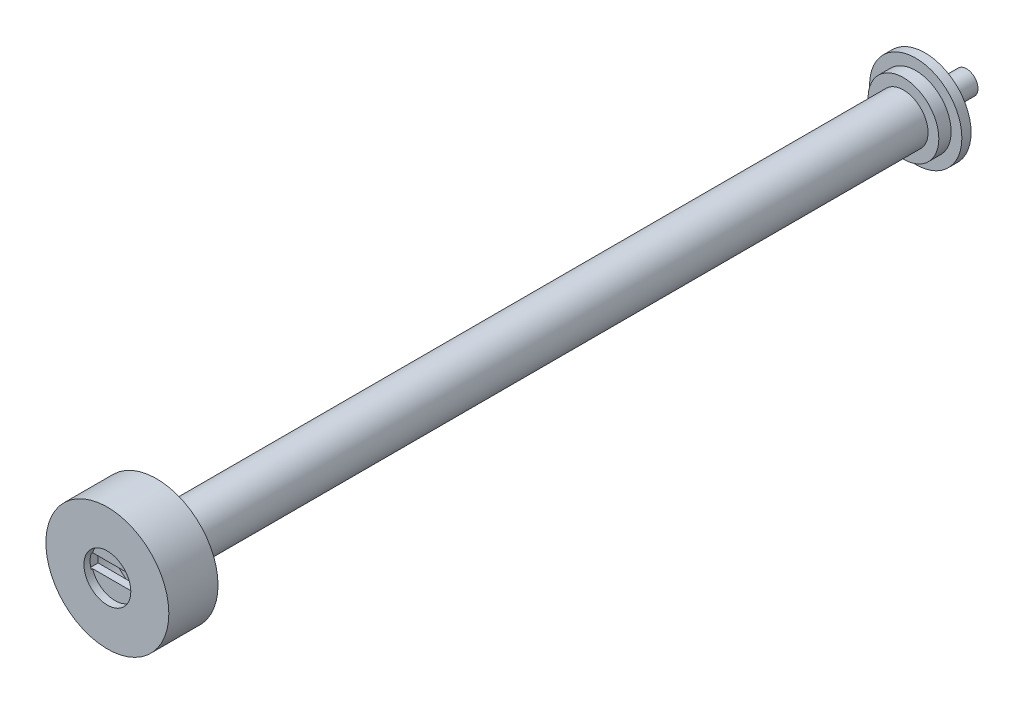
ISO-10303-21;
HEADER;
FILE_DESCRIPTION(('STEP AP214'),'2;1');
FILE_NAME('part.step','',(''),(''),'','','');
FILE_SCHEMA(('AUTOMOTIVE_DESIGN { 1 0 10303 214 1 1 1 1 }'));
ENDSEC;
DATA;
#1=APPLICATION_CONTEXT('core data for automotive mechanical design processes');
#2=APPLICATION_PROTOCOL_DEFINITION('international standard','automotive_design',2000,#1);
#3=PRODUCT_CONTEXT('',#1,'mechanical');
#4=PRODUCT('Part','Part','',(#3));
#5=PRODUCT_RELATED_PRODUCT_CATEGORY('part','',(#4));
#6=PRODUCT_DEFINITION_FORMATION('','',#4);
#7=PRODUCT_DEFINITION_CONTEXT('part definition',#1,'design');
#8=PRODUCT_DEFINITION('design','',#6,#7);
#9=PRODUCT_DEFINITION_SHAPE('','',#8);
#10=(LENGTH_UNIT() NAMED_UNIT(*) SI_UNIT(.MILLI.,.METRE.));
#11=(NAMED_UNIT(*) PLANE_ANGLE_UNIT() SI_UNIT($,.RADIAN.));
#12=(NAMED_UNIT(*) SI_UNIT($,.STERADIAN.) SOLID_ANGLE_UNIT());
#13=UNCERTAINTY_MEASURE_WITH_UNIT(LENGTH_MEASURE(1.E-05),#10,'distance_accuracy_value','');
#14=(GEOMETRIC_REPRESENTATION_CONTEXT(3) GLOBAL_UNCERTAINTY_ASSIGNED_CONTEXT((#13)) GLOBAL_UNIT_ASSIGNED_CONTEXT((#10,
#11,#12)) REPRESENTATION_CONTEXT('',''));
#15=CARTESIAN_POINT('',(0.,0.,0.));
#16=DIRECTION('',(0.,0.,1.));
#17=DIRECTION('',(1.,0.,0.));
#18=AXIS2_PLACEMENT_3D('',#15,#16,#17);
#19=CARTESIAN_POINT('',(0.,0.,165.6));
#20=DIRECTION('',(0.,0.,1.));
#21=DIRECTION('',(1.,0.,0.));
#22=AXIS2_PLACEMENT_3D('',#19,#20,#21);
#23=PLANE('',#22);
#24=DIRECTION('',(-1.,0.,0.));
#25=VECTOR('',#24,1.);
#26=CARTESIAN_POINT('',(175.2,45.9,165.6));
#27=LINE('',#26,#25);
#28=CARTESIAN_POINT('',(169.08581057582,45.9,165.6));
#29=VERTEX_POINT('',#28);
#30=CARTESIAN_POINT('',(168.8,45.9,165.6));
#31=VERTEX_POINT('',#30);
#32=EDGE_CURVE('E169',#29,#31,#27,.T.);
#33=ORIENTED_EDGE('',*,*,#32,.F.);
#34=CARTESIAN_POINT('',(172.,45.,165.6));
#35=DIRECTION('',(0.,0.,1.));
#36=DIRECTION('',(1.,0.,0.));
#37=AXIS2_PLACEMENT_3D('',#34,#35,#36);
#38=CIRCLE('',#37,3.05);
#39=CARTESIAN_POINT('',(169.08581057582,44.1,165.6));
#40=VERTEX_POINT('',#39);
#41=EDGE_CURVE('E231',#29,#40,#38,.T.);
#42=ORIENTED_EDGE('',*,*,#41,.T.);
#43=DIRECTION('',(1.,0.,0.));
#44=VECTOR('',#43,1.);
#45=CARTESIAN_POINT('',(168.8,44.1,165.6));
#46=LINE('',#45,#44);
#47=CARTESIAN_POINT('',(168.8,44.1,165.6));
#48=VERTEX_POINT('',#47);
#49=EDGE_CURVE('E165',#48,#40,#46,.T.);
#50=ORIENTED_EDGE('',*,*,#49,.F.);
#51=DIRECTION('',(0.,-1.,0.));
#52=VECTOR('',#51,1.);
#53=CARTESIAN_POINT('',(168.8,45.9,165.6));
#54=LINE('',#53,#52);
#55=EDGE_CURVE('E158',#31,#48,#54,.T.);
#56=ORIENTED_EDGE('',*,*,#55,.F.);
#57=EDGE_LOOP('',(#33,#42,#50,#56));
#58=FACE_BOUND('',#57,.T.);
#59=ADVANCED_FACE('F43',(#58),#23,.F.);
#60=CARTESIAN_POINT('',(172.,45.,160.8));
#61=DIRECTION('',(0.,0.,1.));
#62=DIRECTION('',(1.,0.,0.));
#63=AXIS2_PLACEMENT_3D('',#60,#61,#62);
#64=CYLINDRICAL_SURFACE('',#63,5.50000000000001);
#65=CARTESIAN_POINT('',(172.,45.,160.8));
#66=DIRECTION('',(0.,0.,1.));
#67=DIRECTION('',(1.,0.,0.));
#68=AXIS2_PLACEMENT_3D('',#65,#66,#67);
#69=CIRCLE('',#68,5.50000000000001);
#70=CARTESIAN_POINT('',(177.5,45.,160.8));
#71=VERTEX_POINT('',#70);
#72=EDGE_CURVE('E181',#71,#71,#69,.T.);
#73=ORIENTED_EDGE('',*,*,#72,.F.);
#74=EDGE_LOOP('',(#73));
#75=FACE_BOUND('',#74,.T.);
#76=CARTESIAN_POINT('',(172.,45.,164.4));
#77=DIRECTION('',(0.,0.,1.));
#78=DIRECTION('',(1.,0.,0.));
#79=AXIS2_PLACEMENT_3D('',#76,#77,#78);
#80=CIRCLE('',#79,5.50000000000001);
#81=CARTESIAN_POINT('',(177.5,45.,164.4));
#82=VERTEX_POINT('',#81);
#83=EDGE_CURVE('E179',#82,#82,#80,.T.);
#84=ORIENTED_EDGE('',*,*,#83,.T.);
#85=EDGE_LOOP('',(#84));
#86=FACE_BOUND('',#85,.T.);
#87=ADVANCED_FACE('F278',(#75,#86),#64,.F.);
#88=CARTESIAN_POINT('',(172.,45.,160.8));
#89=DIRECTION('',(0.,0.,1.));
#90=DIRECTION('',(1.,0.,0.));
#91=AXIS2_PLACEMENT_3D('',#88,#89,#90);
#92=PLANE('',#91);
#93=CARTESIAN_POINT('',(172.,45.,160.8));
#94=DIRECTION('',(0.,0.,1.));
#95=DIRECTION('',(1.,0.,0.));
#96=AXIS2_PLACEMENT_3D('',#93,#94,#95);
#97=CIRCLE('',#96,1.09999999999999);
#98=CARTESIAN_POINT('',(173.1,45.,160.8));
#99=VERTEX_POINT('',#98);
#100=EDGE_CURVE('E125',#99,#99,#97,.T.);
#101=ORIENTED_EDGE('',*,*,#100,.F.);
#102=EDGE_LOOP('',(#101));
#103=FACE_BOUND('',#102,.T.);
#104=ORIENTED_EDGE('',*,*,#72,.T.);
#105=EDGE_LOOP('',(#104));
#106=FACE_BOUND('',#105,.T.);
#107=ADVANCED_FACE('F289',(#103,#106),#92,.T.);
#108=CARTESIAN_POINT('',(172.,45.,164.4));
#109=DIRECTION('',(0.,0.,1.));
#110=DIRECTION('',(1.,0.,0.));
#111=AXIS2_PLACEMENT_3D('',#108,#109,#110);
#112=PLANE('',#111);
#113=DIRECTION('',(-1.,0.,0.));
#114=VECTOR('',#113,1.);
#115=CARTESIAN_POINT('',(172.,45.9,164.4));
#116=LINE('',#115,#114);
#117=CARTESIAN_POINT('',(175.2,45.9,164.4));
#118=VERTEX_POINT('',#117);
#119=CARTESIAN_POINT('',(168.8,45.9,164.4));
#120=VERTEX_POINT('',#119);
#121=EDGE_CURVE('E221',#118,#120,#116,.T.);
#122=ORIENTED_EDGE('',*,*,#121,.T.);
#123=DIRECTION('',(0.,-1.,0.));
#124=VECTOR('',#123,1.);
#125=CARTESIAN_POINT('',(168.8,45.,164.4));
#126=LINE('',#125,#124);
#127=CARTESIAN_POINT('',(168.8,44.1,164.4));
#128=VERTEX_POINT('',#127);
#129=EDGE_CURVE('E230',#120,#128,#126,.T.);
#130=ORIENTED_EDGE('',*,*,#129,.T.);
#131=DIRECTION('',(1.,0.,0.));
#132=VECTOR('',#131,1.);
#133=CARTESIAN_POINT('',(172.,44.1,164.4));
#134=LINE('',#133,#132);
#135=CARTESIAN_POINT('',(175.2,44.1,164.4));
#136=VERTEX_POINT('',#135);
#137=EDGE_CURVE('E217',#128,#136,#134,.T.);
#138=ORIENTED_EDGE('',*,*,#137,.T.);
#139=DIRECTION('',(0.,1.,0.));
#140=VECTOR('',#139,1.);
#141=CARTESIAN_POINT('',(175.2,45.,164.4));
#142=LINE('',#141,#140);
#143=EDGE_CURVE('E222',#136,#118,#142,.T.);
#144=ORIENTED_EDGE('',*,*,#143,.T.);
#145=EDGE_LOOP('',(#122,#130,#138,#144));
#146=FACE_BOUND('',#145,.T.);
#147=ORIENTED_EDGE('',*,*,#83,.F.);
#148=EDGE_LOOP('',(#147));
#149=FACE_BOUND('',#148,.T.);
#150=ADVANCED_FACE('F248',(#146,#149),#112,.F.);
#151=CARTESIAN_POINT('',(168.8,45.9,164.2));
#152=DIRECTION('',(-1.,0.,0.));
#153=DIRECTION('',(0.,0.,1.));
#154=AXIS2_PLACEMENT_3D('',#151,#152,#153);
#155=PLANE('',#154);
#156=DIRECTION('',(0.,0.,1.));
#157=VECTOR('',#156,1.);
#158=CARTESIAN_POINT('',(168.8,45.9,164.2));
#159=LINE('',#158,#157);
#160=EDGE_CURVE('E172',#120,#31,#159,.T.);
#161=ORIENTED_EDGE('',*,*,#160,.T.);
#162=ORIENTED_EDGE('',*,*,#55,.T.);
#163=DIRECTION('',(0.,0.,1.));
#164=VECTOR('',#163,1.);
#165=CARTESIAN_POINT('',(168.8,44.1,164.2));
#166=LINE('',#165,#164);
#167=EDGE_CURVE('E175',#128,#48,#166,.T.);
#168=ORIENTED_EDGE('',*,*,#167,.F.);
#169=ORIENTED_EDGE('',*,*,#129,.F.);
#170=EDGE_LOOP('',(#161,#162,#168,#169));
#171=FACE_BOUND('',#170,.T.);
#172=ADVANCED_FACE('F249',(#171),#155,.F.);
#173=CARTESIAN_POINT('',(175.2,45.9,164.2));
#174=DIRECTION('',(0.,1.,0.));
#175=DIRECTION('',(0.,0.,1.));
#176=AXIS2_PLACEMENT_3D('',#173,#174,#175);
#177=PLANE('',#176);
#178=DIRECTION('',(1.,0.,0.));
#179=VECTOR('',#178,1.);
#180=CARTESIAN_POINT('',(175.2,45.9,165.4));
#181=LINE('',#180,#179);
#182=CARTESIAN_POINT('',(169.08581057582,45.9,165.4));
#183=VERTEX_POINT('',#182);
#184=CARTESIAN_POINT('',(174.91418942418,45.9,165.4));
#185=VERTEX_POINT('',#184);
#186=EDGE_CURVE('E156',#183,#185,#181,.T.);
#187=ORIENTED_EDGE('',*,*,#186,.F.);
#188=DIRECTION('',(0.,0.,1.));
#189=VECTOR('',#188,1.);
#190=CARTESIAN_POINT('',(169.08581057582,45.9,165.4));
#191=LINE('',#190,#189);
#192=EDGE_CURVE('E147',#183,#29,#191,.T.);
#193=ORIENTED_EDGE('',*,*,#192,.T.);
#194=ORIENTED_EDGE('',*,*,#32,.T.);
#195=ORIENTED_EDGE('',*,*,#160,.F.);
#196=ORIENTED_EDGE('',*,*,#121,.F.);
#197=DIRECTION('',(0.,0.,1.));
#198=VECTOR('',#197,1.);
#199=CARTESIAN_POINT('',(175.2,45.9,164.2));
#200=LINE('',#199,#198);
#201=CARTESIAN_POINT('',(175.2,45.9,165.6));
#202=VERTEX_POINT('',#201);
#203=EDGE_CURVE('E176',#118,#202,#200,.T.);
#204=ORIENTED_EDGE('',*,*,#203,.T.);
#205=CARTESIAN_POINT('',(174.91418942418,45.9,165.6));
#206=VERTEX_POINT('',#205);
#207=EDGE_CURVE('E166',#202,#206,#27,.T.);
#208=ORIENTED_EDGE('',*,*,#207,.T.);
#209=DIRECTION('',(0.,0.,1.));
#210=VECTOR('',#209,1.);
#211=CARTESIAN_POINT('',(174.91418942418,45.9,165.4));
#212=LINE('',#211,#210);
#213=EDGE_CURVE('E62',#206,#185,#212,.F.);
#214=ORIENTED_EDGE('',*,*,#213,.T.);
#215=EDGE_LOOP('',(#187,#193,#194,#195,#196,#204,#208,#214));
#216=FACE_BOUND('',#215,.T.);
#217=ADVANCED_FACE('F254',(#216),#177,.F.);
#218=CARTESIAN_POINT('',(175.2,44.1,164.2));
#219=DIRECTION('',(1.,0.,0.));
#220=DIRECTION('',(0.,0.,-1.));
#221=AXIS2_PLACEMENT_3D('',#218,#219,#220);
#222=PLANE('',#221);
#223=DIRECTION('',(0.,0.,1.));
#224=VECTOR('',#223,1.);
#225=CARTESIAN_POINT('',(175.2,44.1,164.2));
#226=LINE('',#225,#224);
#227=CARTESIAN_POINT('',(175.2,44.1,165.6));
#228=VERTEX_POINT('',#227);
#229=EDGE_CURVE('E178',#136,#228,#226,.T.);
#230=ORIENTED_EDGE('',*,*,#229,.T.);
#231=DIRECTION('',(0.,1.,0.));
#232=VECTOR('',#231,1.);
#233=CARTESIAN_POINT('',(175.2,44.1,165.6));
#234=LINE('',#233,#232);
#235=EDGE_CURVE('E164',#228,#202,#234,.T.);
#236=ORIENTED_EDGE('',*,*,#235,.T.);
#237=ORIENTED_EDGE('',*,*,#203,.F.);
#238=ORIENTED_EDGE('',*,*,#143,.F.);
#239=EDGE_LOOP('',(#230,#236,#237,#238));
#240=FACE_BOUND('',#239,.T.);
#241=ADVANCED_FACE('F260',(#240),#222,.F.);
#242=CARTESIAN_POINT('',(168.8,44.1,164.2));
#243=DIRECTION('',(0.,-1.,0.));
#244=DIRECTION('',(0.,0.,-1.));
#245=AXIS2_PLACEMENT_3D('',#242,#243,#244);
#246=PLANE('',#245);
#247=DIRECTION('',(-1.,0.,0.));
#248=VECTOR('',#247,1.);
#249=CARTESIAN_POINT('',(168.8,44.1,165.4));
#250=LINE('',#249,#248);
#251=CARTESIAN_POINT('',(174.91418942418,44.1,165.4));
#252=VERTEX_POINT('',#251);
#253=CARTESIAN_POINT('',(169.08581057582,44.1,165.4));
#254=VERTEX_POINT('',#253);
#255=EDGE_CURVE('E114',#252,#254,#250,.T.);
#256=ORIENTED_EDGE('',*,*,#255,.F.);
#257=DIRECTION('',(0.,0.,1.));
#258=VECTOR('',#257,1.);
#259=CARTESIAN_POINT('',(174.91418942418,44.1,165.4));
#260=LINE('',#259,#258);
#261=CARTESIAN_POINT('',(174.91418942418,44.1,165.6));
#262=VERTEX_POINT('',#261);
#263=EDGE_CURVE('E141',#252,#262,#260,.T.);
#264=ORIENTED_EDGE('',*,*,#263,.T.);
#265=EDGE_CURVE('E161',#262,#228,#46,.T.);
#266=ORIENTED_EDGE('',*,*,#265,.T.);
#267=ORIENTED_EDGE('',*,*,#229,.F.);
#268=ORIENTED_EDGE('',*,*,#137,.F.);
#269=ORIENTED_EDGE('',*,*,#167,.T.);
#270=ORIENTED_EDGE('',*,*,#49,.T.);
#271=DIRECTION('',(0.,0.,1.));
#272=VECTOR('',#271,1.);
#273=CARTESIAN_POINT('',(169.08581057582,44.1,165.4));
#274=LINE('',#273,#272);
#275=EDGE_CURVE('E150',#40,#254,#274,.F.);
#276=ORIENTED_EDGE('',*,*,#275,.T.);
#277=EDGE_LOOP('',(#256,#264,#266,#267,#268,#269,#270,#276));
#278=FACE_BOUND('',#277,.T.);
#279=ADVANCED_FACE('F242',(#278),#246,.F.);
#280=ORIENTED_EDGE('',*,*,#265,.F.);
#281=EDGE_CURVE('E229',#262,#206,#38,.T.);
#282=ORIENTED_EDGE('',*,*,#281,.T.);
#283=ORIENTED_EDGE('',*,*,#207,.F.);
#284=ORIENTED_EDGE('',*,*,#235,.F.);
#285=EDGE_LOOP('',(#280,#282,#283,#284));
#286=FACE_BOUND('',#285,.T.);
#287=ADVANCED_FACE('F265',(#286),#23,.F.);
#288=CARTESIAN_POINT('',(172.,45.,165.4));
#289=DIRECTION('',(0.,0.,1.));
#290=DIRECTION('',(1.,0.,0.));
#291=AXIS2_PLACEMENT_3D('',#288,#289,#290);
#292=PLANE('',#291);
#293=ORIENTED_EDGE('',*,*,#186,.T.);
#294=CARTESIAN_POINT('',(172.,45.,165.4));
#295=DIRECTION('',(0.,0.,1.));
#296=DIRECTION('',(1.,0.,0.));
#297=AXIS2_PLACEMENT_3D('',#294,#295,#296);
#298=CIRCLE('',#297,3.05);
#299=EDGE_CURVE('E137',#185,#183,#298,.T.);
#300=ORIENTED_EDGE('',*,*,#299,.T.);
#301=EDGE_LOOP('',(#293,#300));
#302=FACE_BOUND('',#301,.T.);
#303=ADVANCED_FACE('F262',(#302),#292,.T.);
#304=ORIENTED_EDGE('',*,*,#255,.T.);
#305=EDGE_CURVE('E128',#254,#252,#298,.T.);
#306=ORIENTED_EDGE('',*,*,#305,.T.);
#307=EDGE_LOOP('',(#304,#306));
#308=FACE_BOUND('',#307,.T.);
#309=ADVANCED_FACE('F268',(#308),#292,.T.);
#310=CARTESIAN_POINT('',(172.,45.,165.4));
#311=DIRECTION('',(0.,0.,1.));
#312=DIRECTION('',(1.,0.,0.));
#313=AXIS2_PLACEMENT_3D('',#310,#311,#312);
#314=CYLINDRICAL_SURFACE('',#313,3.05);
#315=CARTESIAN_POINT('',(172.,45.,166.4));
#316=DIRECTION('',(0.,0.,1.));
#317=DIRECTION('',(1.,0.,0.));
#318=AXIS2_PLACEMENT_3D('',#315,#316,#317);
#319=CIRCLE('',#318,3.05);
#320=CARTESIAN_POINT('',(175.05,45.,166.4));
#321=VERTEX_POINT('',#320);
#322=EDGE_CURVE('E153',#321,#321,#319,.T.);
#323=ORIENTED_EDGE('',*,*,#322,.T.);
#324=EDGE_LOOP('',(#323));
#325=FACE_BOUND('',#324,.T.);
#326=ORIENTED_EDGE('',*,*,#299,.F.);
#327=ORIENTED_EDGE('',*,*,#213,.F.);
#328=ORIENTED_EDGE('',*,*,#281,.F.);
#329=ORIENTED_EDGE('',*,*,#263,.F.);
#330=ORIENTED_EDGE('',*,*,#305,.F.);
#331=ORIENTED_EDGE('',*,*,#275,.F.);
#332=ORIENTED_EDGE('',*,*,#41,.F.);
#333=ORIENTED_EDGE('',*,*,#192,.F.);
#334=EDGE_LOOP('',(#326,#327,#328,#329,#330,#331,#332,#333));
#335=FACE_BOUND('',#334,.T.);
#336=ADVANCED_FACE('F264',(#325,#335),#314,.F.);
#337=CARTESIAN_POINT('',(172.,45.,160.5));
#338=DIRECTION('',(0.,0.,-1.));
#339=DIRECTION('',(-1.,0.,0.));
#340=AXIS2_PLACEMENT_3D('',#337,#338,#339);
#341=CYLINDRICAL_SURFACE('',#340,3.20000000000001);
#342=CARTESIAN_POINT('',(172.,41.8,66.1));
#343=CARTESIAN_POINT('',(172.059912032794,41.7999995417529,66.1000006726438));
#344=CARTESIAN_POINT('',(172.119819319531,41.8016978680528,66.0950895000888));
#345=CARTESIAN_POINT('',(172.237862937075,41.8083049955069,66.0756392723217));
#346=CARTESIAN_POINT('',(172.295999193789,41.813213930789,66.0610998148735));
#347=CARTESIAN_POINT('',(172.408781951913,41.8257104106645,66.022954777006));
#348=CARTESIAN_POINT('',(172.463434316581,41.8332933065901,65.9993649244331));
#349=CARTESIAN_POINT('',(172.568006060973,41.8503682960829,65.9438619661876));
#350=CARTESIAN_POINT('',(172.617924413942,41.8598608024364,65.911947060507));
#351=CARTESIAN_POINT('',(172.713435821471,41.8801485772047,65.8394762756631));
#352=CARTESIAN_POINT('',(172.758832146365,41.8909764668898,65.7986703139808));
#353=CARTESIAN_POINT('',(172.842289495185,41.9125398939186,65.7101071678055));
#354=CARTESIAN_POINT('',(172.880348763375,41.9232754085714,65.6623483242967));
#355=CARTESIAN_POINT('',(172.949204708321,41.9438023266914,65.5594280652613));
#356=CARTESIAN_POINT('',(172.979740381126,41.9535542648587,65.5040833949536));
#357=CARTESIAN_POINT('',(173.030985427362,41.9705110971542,65.3886549346988));
#358=CARTESIAN_POINT('',(173.05169801798,41.977716825002,65.3285727038932));
#359=CARTESIAN_POINT('',(173.081961535217,41.9884206429276,65.207619455358));
#360=CARTESIAN_POINT('',(173.091882875158,41.9920413645762,65.1468523028827));
#361=CARTESIAN_POINT('',(173.101440423132,41.9955271050436,65.0244162318191));
#362=CARTESIAN_POINT('',(173.101080052199,41.9953933730824,64.9627476199993));
#363=CARTESIAN_POINT('',(173.090370938345,41.9914923719438,64.8434707179801));
#364=CARTESIAN_POINT('',(173.080512514138,41.9879034756341,64.785811542956));
#365=CARTESIAN_POINT('',(173.05188957753,41.9777894947641,64.6730218285944));
#366=CARTESIAN_POINT('',(173.033123935027,41.9712640376335,64.6178916110916));
#367=CARTESIAN_POINT('',(172.986911080269,41.9558899585648,64.5106386387107));
#368=CARTESIAN_POINT('',(172.95932302723,41.9470040742511,64.4585821423786));
#369=CARTESIAN_POINT('',(172.896346290776,41.9279252011763,64.3596854921805));
#370=CARTESIAN_POINT('',(172.860955241638,41.9177318163982,64.312846926791));
#371=CARTESIAN_POINT('',(172.781049055844,41.8964920378367,64.2229698839598));
#372=CARTESIAN_POINT('',(172.736135246936,41.8854297705858,64.1802888420336));
#373=CARTESIAN_POINT('',(172.639652994073,41.864193703533,64.1029681032425));
#374=CARTESIAN_POINT('',(172.588083829146,41.8540200001891,64.0683292787267));
#375=CARTESIAN_POINT('',(172.478960088285,41.8355586543989,64.0077638332383));
#376=CARTESIAN_POINT('',(172.421345257335,41.8272932752863,63.9819385202698));
#377=CARTESIAN_POINT('',(172.30223606952,41.8137421808976,63.9404594807784));
#378=CARTESIAN_POINT('',(172.240743158953,41.8084553620136,63.9248019865745));
#379=CARTESIAN_POINT('',(172.118645109882,41.8016425921864,63.90474912175));
#380=CARTESIAN_POINT('',(172.058128110963,41.79995561492,63.8998711843365));
#381=CARTESIAN_POINT('',(171.937124760663,41.8000461455838,63.9001339371898));
#382=CARTESIAN_POINT('',(171.876638405716,41.8018230263402,63.9052728137899));
#383=CARTESIAN_POINT('',(171.759381488262,41.8085352267111,63.9250447457431));
#384=CARTESIAN_POINT('',(171.702553871312,41.8133703626725,63.9393768484978));
#385=CARTESIAN_POINT('',(171.592136482376,41.825612556396,63.9767473626939));
#386=CARTESIAN_POINT('',(171.538547128553,41.8330199454886,63.9997868957681));
#387=CARTESIAN_POINT('',(171.434501889044,41.849910021626,64.0546092905382));
#388=CARTESIAN_POINT('',(171.384170762027,41.8594436435244,64.0866127775527));
#389=CARTESIAN_POINT('',(171.289439077884,41.8795109848246,64.1581980176444));
#390=CARTESIAN_POINT('',(171.245040439259,41.8900450258762,64.1977822122181));
#391=CARTESIAN_POINT('',(171.161191470765,41.9115755350381,64.285671897017));
#392=CARTESIAN_POINT('',(171.122085310806,41.9225696678568,64.3343071210952));
#393=CARTESIAN_POINT('',(171.052540813831,41.9432628894168,64.4376822050442));
#394=CARTESIAN_POINT('',(171.022102686708,41.9529619467956,64.492422212694));
#395=CARTESIAN_POINT('',(170.970866426775,41.9698818914863,64.6065633444976));
#396=CARTESIAN_POINT('',(170.950060489389,41.9771047838994,64.6659606492326));
#397=CARTESIAN_POINT('',(170.91885052128,41.9881243244932,64.7877246762201));
#398=CARTESIAN_POINT('',(170.908441404887,41.9919226477344,64.8500899310251));
#399=CARTESIAN_POINT('',(170.898732275356,41.995464529424,64.9723590154337));
#400=CARTESIAN_POINT('',(170.898857367116,41.9954179244142,65.032211592821));
#401=CARTESIAN_POINT('',(170.908784201769,41.9917986511139,65.1509946013877));
#402=CARTESIAN_POINT('',(170.918585296489,41.9882262190104,65.2099250940667));
#403=CARTESIAN_POINT('',(170.947168370759,41.9781187624428,65.3239233145891));
#404=CARTESIAN_POINT('',(170.965752721856,41.9716490880122,65.3790468525101));
#405=CARTESIAN_POINT('',(171.01121169233,41.9565038273515,65.4854339277315));
#406=CARTESIAN_POINT('',(171.038088222416,41.9478277327924,65.5366965720027));
#407=CARTESIAN_POINT('',(171.100805686451,41.9287511651538,65.6364577665317));
#408=CARTESIAN_POINT('',(171.137001333429,41.9182898404608,65.6847215929278));
#409=CARTESIAN_POINT('',(171.216742362372,41.8970646418373,65.7746756051918));
#410=CARTESIAN_POINT('',(171.26028988397,41.8863006805922,65.8163638705094));
#411=CARTESIAN_POINT('',(171.355715347008,41.8651345045646,65.893772045151));
#412=CARTESIAN_POINT('',(171.407868389126,41.8547670280424,65.9291635839479));
#413=CARTESIAN_POINT('',(171.517731528818,41.8360599305754,65.990644860782));
#414=CARTESIAN_POINT('',(171.575440623052,41.8277199444512,66.0167362742965));
#415=CARTESIAN_POINT('',(171.693388190801,41.8141835754081,66.0582073392681));
#416=CARTESIAN_POINT('',(171.753534076232,41.8089172550642,66.0738266128015));
#417=CARTESIAN_POINT('',(171.875788766385,41.8018262585646,66.0947209303254));
#418=CARTESIAN_POINT('',(171.937896932963,41.8000004750055,66.0999993027571));
#419=CARTESIAN_POINT('',(172.,41.8,66.1));
#420=B_SPLINE_CURVE_WITH_KNOTS('',3,(#342,#343,#344,#345,#346,#347,#348,#349,#350,#351,#352,
#353,#354,#355,#356,#357,#358,#359,#360,#361,#362,#363,#364,#365,#366,#367,#368,#369,#370,#371,
#372,#373,#374,#375,#376,#377,#378,#379,#380,#381,#382,#383,#384,#385,#386,#387,#388,#389,#390,
#391,#392,#393,#394,#395,#396,#397,#398,#399,#400,#401,#402,#403,#404,#405,#406,#407,#408,#409,
#410,#411,#412,#413,#414,#415,#416,#417,#418,#419),.UNSPECIFIED.,.T.,.F.,(4,2,2,2,2,2,2,2,2,2,2,
2,2,2,2,2,2,2,2,2,2,2,2,2,2,2,2,2,2,2,2,2,2,2,2,2,2,2,4),(0.,0.179507428973798,
0.359022357614211,0.538226726642115,0.717469874650793,0.902619428071239,1.08781323234978,
1.27873434985061,1.46959289495447,1.65367050029277,1.83768685818835,2.01268598796004,
2.18770732665777,2.36567525967825,2.54369722364503,2.73164397965513,2.91961111296286,
3.10967131602112,3.29966105210548,3.48095688763715,3.66221990039039,3.83783245978662,
4.01346764812957,4.19387665146433,4.37434385661751,4.56355865528744,4.75277803529212,
4.94184382892685,5.13081709450035,5.30948437036803,5.48813967854587,5.66295372898773,
5.83780809073138,6.02068478638275,6.20361479704719,6.39430809816502,6.58496702727399,
6.77109911680104,6.95717128586866),.UNSPECIFIED.);
#421=CARTESIAN_POINT('',(172.,41.8,66.1));
#422=VERTEX_POINT('',#421);
#423=EDGE_CURVE('E126',#422,#422,#420,.T.);
#424=ORIENTED_EDGE('',*,*,#423,.T.);
#425=EDGE_LOOP('',(#424));
#426=FACE_BOUND('',#425,.T.);
#427=CARTESIAN_POINT('',(172.,45.,62.8));
#428=DIRECTION('',(0.,0.,1.));
#429=DIRECTION('',(1.,0.,0.));
#430=AXIS2_PLACEMENT_3D('',#427,#428,#429);
#431=CIRCLE('',#430,3.20000000000001);
#432=CARTESIAN_POINT('',(175.2,45.,62.8));
#433=VERTEX_POINT('',#432);
#434=EDGE_CURVE('E191',#433,#433,#431,.F.);
#435=ORIENTED_EDGE('',*,*,#434,.F.);
#436=EDGE_LOOP('',(#435));
#437=FACE_BOUND('',#436,.T.);
#438=CARTESIAN_POINT('',(172.,45.,160.));
#439=DIRECTION('',(0.,0.,1.));
#440=DIRECTION('',(1.,0.,0.));
#441=AXIS2_PLACEMENT_3D('',#438,#439,#440);
#442=CIRCLE('',#441,3.20000000000001);
#443=CARTESIAN_POINT('',(175.2,45.,160.));
#444=VERTEX_POINT('',#443);
#445=EDGE_CURVE('E205',#444,#444,#442,.T.);
#446=ORIENTED_EDGE('',*,*,#445,.F.);
#447=EDGE_LOOP('',(#446));
#448=FACE_BOUND('',#447,.T.);
#449=ADVANCED_FACE('F270',(#426,#437,#448),#341,.T.);
#450=CARTESIAN_POINT('',(172.,45.,60.1));
#451=DIRECTION('',(0.,0.,-1.));
#452=DIRECTION('',(-1.,0.,0.));
#453=AXIS2_PLACEMENT_3D('',#450,#451,#452);
#454=CYLINDRICAL_SURFACE('',#453,1.5);
#455=CARTESIAN_POINT('',(172.,45.,54.6));
#456=DIRECTION('',(0.,0.,1.));
#457=DIRECTION('',(1.,0.,0.));
#458=AXIS2_PLACEMENT_3D('',#455,#456,#457);
#459=CIRCLE('',#458,1.5);
#460=CARTESIAN_POINT('',(173.5,45.,54.6));
#461=VERTEX_POINT('',#460);
#462=EDGE_CURVE('E210',#461,#461,#459,.T.);
#463=ORIENTED_EDGE('',*,*,#462,.T.);
#464=EDGE_LOOP('',(#463));
#465=FACE_BOUND('',#464,.T.);
#466=CARTESIAN_POINT('',(172.,45.,60.));
#467=DIRECTION('',(0.,0.,1.));
#468=DIRECTION('',(1.,0.,0.));
#469=AXIS2_PLACEMENT_3D('',#466,#467,#468);
#470=CIRCLE('',#469,1.5);
#471=CARTESIAN_POINT('',(173.5,45.,60.));
#472=VERTEX_POINT('',#471);
#473=EDGE_CURVE('E201',#472,#472,#470,.T.);
#474=ORIENTED_EDGE('',*,*,#473,.F.);
#475=EDGE_LOOP('',(#474));
#476=FACE_BOUND('',#475,.T.);
#477=ADVANCED_FACE('F44',(#465,#476),#454,.T.);
#478=CARTESIAN_POINT('',(172.,45.,54.6));
#479=DIRECTION('',(0.,0.,1.));
#480=DIRECTION('',(1.,0.,0.));
#481=AXIS2_PLACEMENT_3D('',#478,#479,#480);
#482=PLANE('',#481);
#483=ORIENTED_EDGE('',*,*,#462,.F.);
#484=EDGE_LOOP('',(#483));
#485=FACE_BOUND('',#484,.T.);
#486=ADVANCED_FACE('F336',(#485),#482,.F.);
#487=CARTESIAN_POINT('',(172.,45.,61.2));
#488=DIRECTION('',(0.,0.,-1.));
#489=DIRECTION('',(-1.,0.,0.));
#490=AXIS2_PLACEMENT_3D('',#487,#488,#489);
#491=CYLINDRICAL_SURFACE('',#490,6.00000000000001);
#492=CARTESIAN_POINT('',(172.,45.,61.2));
#493=DIRECTION('',(0.,0.,1.));
#494=DIRECTION('',(1.,0.,0.));
#495=AXIS2_PLACEMENT_3D('',#492,#493,#494);
#496=CIRCLE('',#495,6.00000000000001);
#497=CARTESIAN_POINT('',(178.,45.,61.2));
#498=VERTEX_POINT('',#497);
#499=EDGE_CURVE('E204',#498,#498,#496,.T.);
#500=ORIENTED_EDGE('',*,*,#499,.F.);
#501=EDGE_LOOP('',(#500));
#502=FACE_BOUND('',#501,.T.);
#503=CARTESIAN_POINT('',(172.,45.,60.));
#504=DIRECTION('',(0.,0.,1.));
#505=DIRECTION('',(1.,0.,0.));
#506=AXIS2_PLACEMENT_3D('',#503,#504,#505);
#507=CIRCLE('',#506,6.00000000000001);
#508=CARTESIAN_POINT('',(178.,45.,60.));
#509=VERTEX_POINT('',#508);
#510=EDGE_CURVE('E196',#509,#509,#507,.T.);
#511=ORIENTED_EDGE('',*,*,#510,.T.);
#512=EDGE_LOOP('',(#511));
#513=FACE_BOUND('',#512,.T.);
#514=ADVANCED_FACE('F329',(#502,#513),#491,.T.);
#515=CARTESIAN_POINT('',(172.,45.,61.2));
#516=DIRECTION('',(0.,0.,1.));
#517=DIRECTION('',(1.,0.,0.));
#518=AXIS2_PLACEMENT_3D('',#515,#516,#517);
#519=PLANE('',#518);
#520=CARTESIAN_POINT('',(172.,45.,61.2));
#521=DIRECTION('',(0.,0.,1.));
#522=DIRECTION('',(1.,0.,0.));
#523=AXIS2_PLACEMENT_3D('',#520,#521,#522);
#524=CIRCLE('',#523,4.59999999999999);
#525=CARTESIAN_POINT('',(176.6,45.,61.2));
#526=VERTEX_POINT('',#525);
#527=EDGE_CURVE('E200',#526,#526,#524,.T.);
#528=ORIENTED_EDGE('',*,*,#527,.F.);
#529=EDGE_LOOP('',(#528));
#530=FACE_BOUND('',#529,.T.);
#531=ORIENTED_EDGE('',*,*,#499,.T.);
#532=EDGE_LOOP('',(#531));
#533=FACE_BOUND('',#532,.T.);
#534=ADVANCED_FACE('F330',(#530,#533),#519,.T.);
#535=CARTESIAN_POINT('',(172.,45.,60.));
#536=DIRECTION('',(0.,0.,1.));
#537=DIRECTION('',(1.,0.,0.));
#538=AXIS2_PLACEMENT_3D('',#535,#536,#537);
#539=PLANE('',#538);
#540=ORIENTED_EDGE('',*,*,#473,.T.);
#541=EDGE_LOOP('',(#540));
#542=FACE_BOUND('',#541,.T.);
#543=ORIENTED_EDGE('',*,*,#510,.F.);
#544=EDGE_LOOP('',(#543));
#545=FACE_BOUND('',#544,.T.);
#546=ADVANCED_FACE('F324',(#542,#545),#539,.F.);
#547=CARTESIAN_POINT('',(172.,45.,62.8));
#548=DIRECTION('',(0.,0.,-1.));
#549=DIRECTION('',(-1.,0.,0.));
#550=AXIS2_PLACEMENT_3D('',#547,#548,#549);
#551=CYLINDRICAL_SURFACE('',#550,4.59999999999999);
#552=CARTESIAN_POINT('',(172.,45.,62.8));
#553=DIRECTION('',(0.,0.,1.));
#554=DIRECTION('',(1.,0.,0.));
#555=AXIS2_PLACEMENT_3D('',#552,#553,#554);
#556=CIRCLE('',#555,4.59999999999999);
#557=CARTESIAN_POINT('',(176.6,45.,62.8));
#558=VERTEX_POINT('',#557);
#559=EDGE_CURVE('E192',#558,#558,#556,.T.);
#560=ORIENTED_EDGE('',*,*,#559,.F.);
#561=EDGE_LOOP('',(#560));
#562=FACE_BOUND('',#561,.T.);
#563=ORIENTED_EDGE('',*,*,#527,.T.);
#564=EDGE_LOOP('',(#563));
#565=FACE_BOUND('',#564,.T.);
#566=ADVANCED_FACE('F321',(#562,#565),#551,.T.);
#567=CARTESIAN_POINT('',(172.,45.,62.8));
#568=DIRECTION('',(0.,0.,1.));
#569=DIRECTION('',(1.,0.,0.));
#570=AXIS2_PLACEMENT_3D('',#567,#568,#569);
#571=PLANE('',#570);
#572=ORIENTED_EDGE('',*,*,#434,.T.);
#573=EDGE_LOOP('',(#572));
#574=FACE_BOUND('',#573,.T.);
#575=ORIENTED_EDGE('',*,*,#559,.T.);
#576=EDGE_LOOP('',(#575));
#577=FACE_BOUND('',#576,.T.);
#578=ADVANCED_FACE('F312',(#574,#577),#571,.T.);
#579=CARTESIAN_POINT('',(172.,45.,166.4));
#580=DIRECTION('',(0.,0.,-1.));
#581=DIRECTION('',(-1.,0.,0.));
#582=AXIS2_PLACEMENT_3D('',#579,#580,#581);
#583=CYLINDRICAL_SURFACE('',#582,8.00000000000001);
#584=CARTESIAN_POINT('',(172.,45.,166.4));
#585=DIRECTION('',(0.,0.,1.));
#586=DIRECTION('',(1.,0.,0.));
#587=AXIS2_PLACEMENT_3D('',#584,#585,#586);
#588=CIRCLE('',#587,8.00000000000001);
#589=CARTESIAN_POINT('',(180.,45.,166.4));
#590=VERTEX_POINT('',#589);
#591=EDGE_CURVE('E188',#590,#590,#588,.T.);
#592=ORIENTED_EDGE('',*,*,#591,.F.);
#593=EDGE_LOOP('',(#592));
#594=FACE_BOUND('',#593,.T.);
#595=CARTESIAN_POINT('',(172.,45.,160.));
#596=DIRECTION('',(0.,0.,1.));
#597=DIRECTION('',(1.,0.,0.));
#598=AXIS2_PLACEMENT_3D('',#595,#596,#597);
#599=CIRCLE('',#598,8.00000000000001);
#600=CARTESIAN_POINT('',(180.,45.,160.));
#601=VERTEX_POINT('',#600);
#602=EDGE_CURVE('E186',#601,#601,#599,.T.);
#603=ORIENTED_EDGE('',*,*,#602,.T.);
#604=EDGE_LOOP('',(#603));
#605=FACE_BOUND('',#604,.T.);
#606=ADVANCED_FACE('F310',(#594,#605),#583,.T.);
#607=CARTESIAN_POINT('',(172.,45.,166.4));
#608=DIRECTION('',(0.,0.,1.));
#609=DIRECTION('',(1.,0.,0.));
#610=AXIS2_PLACEMENT_3D('',#607,#608,#609);
#611=PLANE('',#610);
#612=ORIENTED_EDGE('',*,*,#322,.F.);
#613=EDGE_LOOP('',(#612));
#614=FACE_BOUND('',#613,.T.);
#615=ORIENTED_EDGE('',*,*,#591,.T.);
#616=EDGE_LOOP('',(#615));
#617=FACE_BOUND('',#616,.T.);
#618=ADVANCED_FACE('F307',(#614,#617),#611,.T.);
#619=CARTESIAN_POINT('',(172.,45.,160.));
#620=DIRECTION('',(0.,0.,1.));
#621=DIRECTION('',(1.,0.,0.));
#622=AXIS2_PLACEMENT_3D('',#619,#620,#621);
#623=PLANE('',#622);
#624=ORIENTED_EDGE('',*,*,#445,.T.);
#625=EDGE_LOOP('',(#624));
#626=FACE_BOUND('',#625,.T.);
#627=ORIENTED_EDGE('',*,*,#602,.F.);
#628=EDGE_LOOP('',(#627));
#629=FACE_BOUND('',#628,.T.);
#630=ADVANCED_FACE('F117',(#626,#629),#623,.F.);
#631=CARTESIAN_POINT('',(172.,45.,63.));
#632=DIRECTION('',(0.,0.,1.));
#633=DIRECTION('',(1.,0.,0.));
#634=AXIS2_PLACEMENT_3D('',#631,#632,#633);
#635=CYLINDRICAL_SURFACE('',#634,1.09999999999999);
#636=CARTESIAN_POINT('',(172.,45.,65.));
#637=DIRECTION('',(0.,-0.707106781186547,0.707106781186547));
#638=DIRECTION('',(0.,0.707106781186547,0.707106781186547));
#639=AXIS2_PLACEMENT_3D('',#636,#637,#638);
#640=ELLIPSE('',#639,1.55563491861039,1.09999999999999);
#641=CARTESIAN_POINT('',(170.9,45.,65.));
#642=VERTEX_POINT('',#641);
#643=CARTESIAN_POINT('',(173.1,45.,65.));
#644=VERTEX_POINT('',#643);
#645=EDGE_CURVE('E51',#642,#644,#640,.T.);
#646=ORIENTED_EDGE('',*,*,#645,.T.);
#647=CARTESIAN_POINT('',(172.,45.,65.));
#648=DIRECTION('',(0.,0.707106781186547,0.707106781186547));
#649=DIRECTION('',(0.,-0.707106781186547,0.707106781186547));
#650=AXIS2_PLACEMENT_3D('',#647,#648,#649);
#651=ELLIPSE('',#650,1.55563491861039,1.09999999999999);
#652=EDGE_CURVE('E11',#644,#642,#651,.F.);
#653=ORIENTED_EDGE('',*,*,#652,.T.);
#654=EDGE_LOOP('',(#646,#653));
#655=FACE_BOUND('',#654,.T.);
#656=ORIENTED_EDGE('',*,*,#100,.T.);
#657=EDGE_LOOP('',(#656));
#658=FACE_BOUND('',#657,.T.);
#659=CARTESIAN_POINT('',(172.,45.,63.));
#660=DIRECTION('',(0.,0.,1.));
#661=DIRECTION('',(1.,0.,0.));
#662=AXIS2_PLACEMENT_3D('',#659,#660,#661);
#663=CIRCLE('',#662,1.09999999999999);
#664=CARTESIAN_POINT('',(173.1,45.,63.));
#665=VERTEX_POINT('',#664);
#666=EDGE_CURVE('E127',#665,#665,#663,.T.);
#667=ORIENTED_EDGE('',*,*,#666,.F.);
#668=EDGE_LOOP('',(#667));
#669=FACE_BOUND('',#668,.T.);
#670=ADVANCED_FACE('F111',(#655,#658,#669),#635,.F.);
#671=CARTESIAN_POINT('',(172.,45.,63.));
#672=DIRECTION('',(0.,0.,1.));
#673=DIRECTION('',(1.,0.,0.));
#674=AXIS2_PLACEMENT_3D('',#671,#672,#673);
#675=PLANE('',#674);
#676=ORIENTED_EDGE('',*,*,#666,.T.);
#677=EDGE_LOOP('',(#676));
#678=FACE_BOUND('',#677,.T.);
#679=ADVANCED_FACE('F120',(#678),#675,.T.);
#680=CARTESIAN_POINT('',(172.,40.5,65.));
#681=DIRECTION('',(0.,1.,0.));
#682=DIRECTION('',(0.,0.,1.));
#683=AXIS2_PLACEMENT_3D('',#680,#681,#682);
#684=CYLINDRICAL_SURFACE('',#683,1.09999999999999);
#685=ORIENTED_EDGE('',*,*,#645,.F.);
#686=ORIENTED_EDGE('',*,*,#652,.F.);
#687=EDGE_LOOP('',(#685,#686));
#688=FACE_BOUND('',#687,.T.);
#689=ORIENTED_EDGE('',*,*,#423,.F.);
#690=EDGE_LOOP('',(#689));
#691=FACE_BOUND('',#690,.T.);
#692=ADVANCED_FACE('F109',(#688,#691),#684,.F.);
#693=CLOSED_SHELL('',(#59,#87,#107,#150,#172,#217,#241,#279,#287,#303,#309,#336,#449,#477,#486,
#514,#534,#546,#566,#578,#606,#618,#630,#670,#679,#692));
#694=MANIFOLD_SOLID_BREP('B2',#693);
#695=ADVANCED_BREP_SHAPE_REPRESENTATION('',(#18,#694),#14);
#696=SHAPE_DEFINITION_REPRESENTATION(#9,#695);
ENDSEC;
END-ISO-10303-21;
